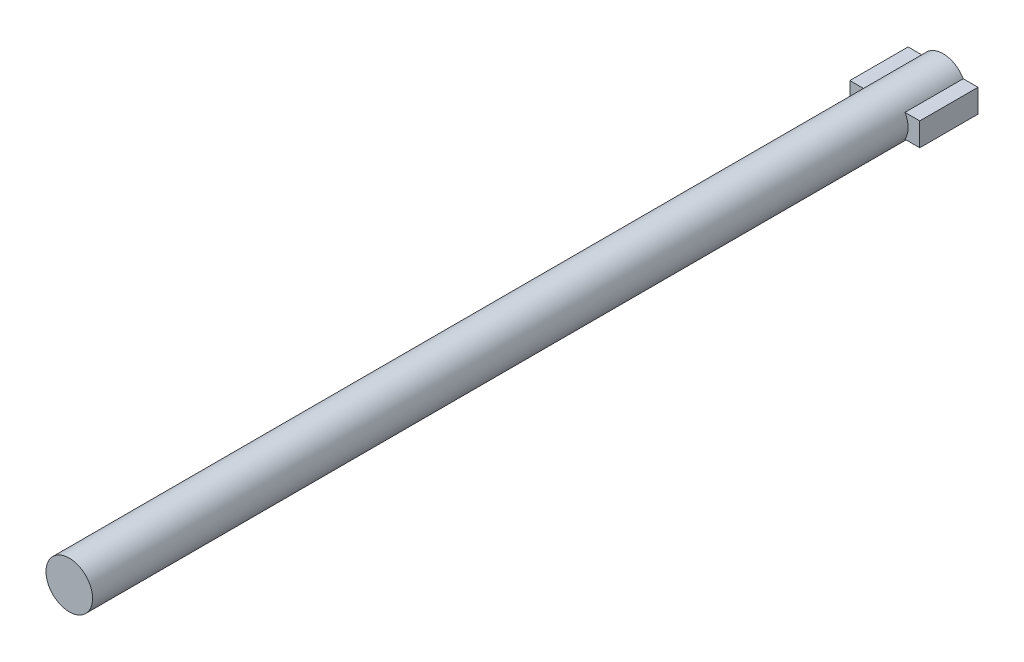
ISO-10303-21;
HEADER;
FILE_DESCRIPTION(('STEP AP214'),'2;1');
FILE_NAME('part.step','',(''),(''),'','','');
FILE_SCHEMA(('AUTOMOTIVE_DESIGN { 1 0 10303 214 1 1 1 1 }'));
ENDSEC;
DATA;
#1=APPLICATION_CONTEXT('core data for automotive mechanical design processes');
#2=APPLICATION_PROTOCOL_DEFINITION('international standard','automotive_design',2000,#1);
#3=PRODUCT_CONTEXT('',#1,'mechanical');
#4=PRODUCT('Part','Part','',(#3));
#5=PRODUCT_RELATED_PRODUCT_CATEGORY('part','',(#4));
#6=PRODUCT_DEFINITION_FORMATION('','',#4);
#7=PRODUCT_DEFINITION_CONTEXT('part definition',#1,'design');
#8=PRODUCT_DEFINITION('design','',#6,#7);
#9=PRODUCT_DEFINITION_SHAPE('','',#8);
#10=(LENGTH_UNIT() NAMED_UNIT(*) SI_UNIT(.MILLI.,.METRE.));
#11=(NAMED_UNIT(*) PLANE_ANGLE_UNIT() SI_UNIT($,.RADIAN.));
#12=(NAMED_UNIT(*) SI_UNIT($,.STERADIAN.) SOLID_ANGLE_UNIT());
#13=UNCERTAINTY_MEASURE_WITH_UNIT(LENGTH_MEASURE(1.E-05),#10,'distance_accuracy_value','');
#14=(GEOMETRIC_REPRESENTATION_CONTEXT(3) GLOBAL_UNCERTAINTY_ASSIGNED_CONTEXT((#13)) GLOBAL_UNIT_ASSIGNED_CONTEXT((#10,
#11,#12)) REPRESENTATION_CONTEXT('',''));
#15=CARTESIAN_POINT('',(0.,0.,0.));
#16=DIRECTION('',(0.,0.,1.));
#17=DIRECTION('',(1.,0.,0.));
#18=AXIS2_PLACEMENT_3D('',#15,#16,#17);
#19=CARTESIAN_POINT('',(0.,0.,150.));
#20=DIRECTION('',(0.,0.,-1.));
#21=DIRECTION('',(-1.,0.,0.));
#22=AXIS2_PLACEMENT_3D('',#19,#20,#21);
#23=CYLINDRICAL_SURFACE('',#22,4.);
#24=CARTESIAN_POINT('',(0.,0.,10.));
#25=DIRECTION('',(0.,0.,-1.));
#26=DIRECTION('',(-1.,0.,0.));
#27=AXIS2_PLACEMENT_3D('',#24,#25,#26);
#28=CIRCLE('',#27,4.);
#29=CARTESIAN_POINT('',(3.46410161513775,2.,10.));
#30=VERTEX_POINT('',#29);
#31=CARTESIAN_POINT('',(3.46410161513775,-2.,10.));
#32=VERTEX_POINT('',#31);
#33=EDGE_CURVE('E11',#30,#32,#28,.T.);
#34=ORIENTED_EDGE('',*,*,#33,.F.);
#35=DIRECTION('',(0.,0.,-1.));
#36=VECTOR('',#35,1.);
#37=CARTESIAN_POINT('',(3.46410161513775,2.,150.));
#38=LINE('',#37,#36);
#39=CARTESIAN_POINT('',(3.46410161513775,2.,0.));
#40=VERTEX_POINT('',#39);
#41=EDGE_CURVE('E150',#30,#40,#38,.T.);
#42=ORIENTED_EDGE('',*,*,#41,.T.);
#43=CARTESIAN_POINT('',(0.,0.,0.));
#44=DIRECTION('',(0.,0.,1.));
#45=DIRECTION('',(1.,0.,0.));
#46=AXIS2_PLACEMENT_3D('',#43,#44,#45);
#47=CIRCLE('',#46,4.);
#48=CARTESIAN_POINT('',(-3.46410161513775,2.,0.));
#49=VERTEX_POINT('',#48);
#50=EDGE_CURVE('E155',#40,#49,#47,.T.);
#51=ORIENTED_EDGE('',*,*,#50,.T.);
#52=DIRECTION('',(0.,0.,-1.));
#53=VECTOR('',#52,1.);
#54=CARTESIAN_POINT('',(-3.46410161513775,2.,150.));
#55=LINE('',#54,#53);
#56=CARTESIAN_POINT('',(-3.46410161513775,2.,10.));
#57=VERTEX_POINT('',#56);
#58=EDGE_CURVE('E148',#49,#57,#55,.F.);
#59=ORIENTED_EDGE('',*,*,#58,.T.);
#60=CARTESIAN_POINT('',(-3.46410161513775,-2.,10.));
#61=VERTEX_POINT('',#60);
#62=EDGE_CURVE('E38',#61,#57,#28,.T.);
#63=ORIENTED_EDGE('',*,*,#62,.F.);
#64=DIRECTION('',(0.,0.,-1.));
#65=VECTOR('',#64,1.);
#66=CARTESIAN_POINT('',(-3.46410161513775,-2.,150.));
#67=LINE('',#66,#65);
#68=CARTESIAN_POINT('',(-3.46410161513776,-2.,0.));
#69=VERTEX_POINT('',#68);
#70=EDGE_CURVE('E145',#61,#69,#67,.T.);
#71=ORIENTED_EDGE('',*,*,#70,.T.);
#72=CARTESIAN_POINT('',(3.46410161513775,-2.,0.));
#73=VERTEX_POINT('',#72);
#74=EDGE_CURVE('E152',#69,#73,#47,.T.);
#75=ORIENTED_EDGE('',*,*,#74,.T.);
#76=DIRECTION('',(0.,0.,-1.));
#77=VECTOR('',#76,1.);
#78=CARTESIAN_POINT('',(3.46410161513775,-2.,150.));
#79=LINE('',#78,#77);
#80=EDGE_CURVE('E49',#73,#32,#79,.F.);
#81=ORIENTED_EDGE('',*,*,#80,.T.);
#82=EDGE_LOOP('',(#34,#42,#51,#59,#63,#71,#75,#81));
#83=FACE_BOUND('',#82,.T.);
#84=CARTESIAN_POINT('',(0.,0.,150.));
#85=DIRECTION('',(0.,0.,1.));
#86=DIRECTION('',(1.,0.,0.));
#87=AXIS2_PLACEMENT_3D('',#84,#85,#86);
#88=CIRCLE('',#87,4.);
#89=CARTESIAN_POINT('',(4.,0.,150.));
#90=VERTEX_POINT('',#89);
#91=EDGE_CURVE('E153',#90,#90,#88,.T.);
#92=ORIENTED_EDGE('',*,*,#91,.F.);
#93=EDGE_LOOP('',(#92));
#94=FACE_BOUND('',#93,.T.);
#95=ADVANCED_FACE('F35',(#83,#94),#23,.T.);
#96=CARTESIAN_POINT('',(0.,0.,150.));
#97=DIRECTION('',(0.,0.,1.));
#98=DIRECTION('',(1.,0.,0.));
#99=AXIS2_PLACEMENT_3D('',#96,#97,#98);
#100=PLANE('',#99);
#101=ORIENTED_EDGE('',*,*,#91,.T.);
#102=EDGE_LOOP('',(#101));
#103=FACE_BOUND('',#102,.T.);
#104=ADVANCED_FACE('F180',(#103),#100,.T.);
#105=CARTESIAN_POINT('',(0.,0.,0.));
#106=DIRECTION('',(0.,0.,1.));
#107=DIRECTION('',(1.,0.,0.));
#108=AXIS2_PLACEMENT_3D('',#105,#106,#107);
#109=PLANE('',#108);
#110=ORIENTED_EDGE('',*,*,#74,.F.);
#111=DIRECTION('',(-1.,0.,0.));
#112=VECTOR('',#111,1.);
#113=CARTESIAN_POINT('',(6.,-2.,0.));
#114=LINE('',#113,#112);
#115=CARTESIAN_POINT('',(-6.,-2.,0.));
#116=VERTEX_POINT('',#115);
#117=EDGE_CURVE('E134',#69,#116,#114,.T.);
#118=ORIENTED_EDGE('',*,*,#117,.T.);
#119=DIRECTION('',(0.,1.,0.));
#120=VECTOR('',#119,1.);
#121=CARTESIAN_POINT('',(-6.,2.,0.));
#122=LINE('',#121,#120);
#123=CARTESIAN_POINT('',(-6.,2.,0.));
#124=VERTEX_POINT('',#123);
#125=EDGE_CURVE('E136',#116,#124,#122,.T.);
#126=ORIENTED_EDGE('',*,*,#125,.T.);
#127=DIRECTION('',(1.,0.,0.));
#128=VECTOR('',#127,1.);
#129=CARTESIAN_POINT('',(6.,2.,0.));
#130=LINE('',#129,#128);
#131=EDGE_CURVE('E121',#124,#49,#130,.T.);
#132=ORIENTED_EDGE('',*,*,#131,.T.);
#133=ORIENTED_EDGE('',*,*,#50,.F.);
#134=CARTESIAN_POINT('',(6.,2.,0.));
#135=VERTEX_POINT('',#134);
#136=EDGE_CURVE('E124',#40,#135,#130,.T.);
#137=ORIENTED_EDGE('',*,*,#136,.T.);
#138=DIRECTION('',(0.,-1.,0.));
#139=VECTOR('',#138,1.);
#140=CARTESIAN_POINT('',(6.,2.,0.));
#141=LINE('',#140,#139);
#142=CARTESIAN_POINT('',(6.,-2.,0.));
#143=VERTEX_POINT('',#142);
#144=EDGE_CURVE('E132',#135,#143,#141,.T.);
#145=ORIENTED_EDGE('',*,*,#144,.T.);
#146=EDGE_CURVE('E101',#143,#73,#114,.T.);
#147=ORIENTED_EDGE('',*,*,#146,.T.);
#148=EDGE_LOOP('',(#110,#118,#126,#132,#133,#137,#145,#147));
#149=FACE_BOUND('',#148,.T.);
#150=ADVANCED_FACE('F161',(#149),#109,.F.);
#151=CARTESIAN_POINT('',(-6.,2.,10.));
#152=DIRECTION('',(-1.,0.,0.));
#153=DIRECTION('',(0.,-1.,0.));
#154=AXIS2_PLACEMENT_3D('',#151,#152,#153);
#155=PLANE('',#154);
#156=ORIENTED_EDGE('',*,*,#125,.F.);
#157=DIRECTION('',(0.,0.,-1.));
#158=VECTOR('',#157,1.);
#159=CARTESIAN_POINT('',(-6.,-2.,10.));
#160=LINE('',#159,#158);
#161=CARTESIAN_POINT('',(-6.,-2.,10.));
#162=VERTEX_POINT('',#161);
#163=EDGE_CURVE('E106',#162,#116,#160,.T.);
#164=ORIENTED_EDGE('',*,*,#163,.F.);
#165=DIRECTION('',(0.,1.,0.));
#166=VECTOR('',#165,1.);
#167=CARTESIAN_POINT('',(-6.,2.,10.));
#168=LINE('',#167,#166);
#169=CARTESIAN_POINT('',(-6.,2.,10.));
#170=VERTEX_POINT('',#169);
#171=EDGE_CURVE('E114',#162,#170,#168,.T.);
#172=ORIENTED_EDGE('',*,*,#171,.T.);
#173=DIRECTION('',(0.,0.,-1.));
#174=VECTOR('',#173,1.);
#175=CARTESIAN_POINT('',(-6.,2.,10.));
#176=LINE('',#175,#174);
#177=EDGE_CURVE('E140',#170,#124,#176,.T.);
#178=ORIENTED_EDGE('',*,*,#177,.T.);
#179=EDGE_LOOP('',(#156,#164,#172,#178));
#180=FACE_BOUND('',#179,.T.);
#181=ADVANCED_FACE('F190',(#180),#155,.T.);
#182=CARTESIAN_POINT('',(0.,0.,10.));
#183=DIRECTION('',(0.,0.,-1.));
#184=DIRECTION('',(-1.,0.,0.));
#185=AXIS2_PLACEMENT_3D('',#182,#183,#184);
#186=PLANE('',#185);
#187=DIRECTION('',(-1.,0.,0.));
#188=VECTOR('',#187,1.);
#189=CARTESIAN_POINT('',(6.,-2.,10.));
#190=LINE('',#189,#188);
#191=EDGE_CURVE('E115',#61,#162,#190,.T.);
#192=ORIENTED_EDGE('',*,*,#191,.F.);
#193=ORIENTED_EDGE('',*,*,#62,.T.);
#194=DIRECTION('',(1.,0.,0.));
#195=VECTOR('',#194,1.);
#196=CARTESIAN_POINT('',(6.,2.,10.));
#197=LINE('',#196,#195);
#198=EDGE_CURVE('E107',#170,#57,#197,.T.);
#199=ORIENTED_EDGE('',*,*,#198,.F.);
#200=ORIENTED_EDGE('',*,*,#171,.F.);
#201=EDGE_LOOP('',(#192,#193,#199,#200));
#202=FACE_BOUND('',#201,.T.);
#203=ADVANCED_FACE('F175',(#202),#186,.F.);
#204=CARTESIAN_POINT('',(6.,-2.,10.));
#205=DIRECTION('',(0.,-1.,0.));
#206=DIRECTION('',(1.,0.,0.));
#207=AXIS2_PLACEMENT_3D('',#204,#205,#206);
#208=PLANE('',#207);
#209=ORIENTED_EDGE('',*,*,#70,.F.);
#210=ORIENTED_EDGE('',*,*,#191,.T.);
#211=ORIENTED_EDGE('',*,*,#163,.T.);
#212=ORIENTED_EDGE('',*,*,#117,.F.);
#213=EDGE_LOOP('',(#209,#210,#211,#212));
#214=FACE_BOUND('',#213,.T.);
#215=ADVANCED_FACE('F173',(#214),#208,.T.);
#216=CARTESIAN_POINT('',(6.,2.,10.));
#217=DIRECTION('',(0.,1.,0.));
#218=DIRECTION('',(0.,0.,1.));
#219=AXIS2_PLACEMENT_3D('',#216,#217,#218);
#220=PLANE('',#219);
#221=ORIENTED_EDGE('',*,*,#58,.F.);
#222=ORIENTED_EDGE('',*,*,#131,.F.);
#223=ORIENTED_EDGE('',*,*,#177,.F.);
#224=ORIENTED_EDGE('',*,*,#198,.T.);
#225=EDGE_LOOP('',(#221,#222,#223,#224));
#226=FACE_BOUND('',#225,.T.);
#227=ADVANCED_FACE('F167',(#226),#220,.T.);
#228=CARTESIAN_POINT('',(6.,2.,10.));
#229=VERTEX_POINT('',#228);
#230=EDGE_CURVE('E129',#30,#229,#197,.T.);
#231=ORIENTED_EDGE('',*,*,#230,.F.);
#232=ORIENTED_EDGE('',*,*,#33,.T.);
#233=CARTESIAN_POINT('',(6.,-2.,10.));
#234=VERTEX_POINT('',#233);
#235=EDGE_CURVE('E99',#234,#32,#190,.T.);
#236=ORIENTED_EDGE('',*,*,#235,.F.);
#237=DIRECTION('',(0.,-1.,0.));
#238=VECTOR('',#237,1.);
#239=CARTESIAN_POINT('',(6.,2.,10.));
#240=LINE('',#239,#238);
#241=EDGE_CURVE('E113',#229,#234,#240,.T.);
#242=ORIENTED_EDGE('',*,*,#241,.F.);
#243=EDGE_LOOP('',(#231,#232,#236,#242));
#244=FACE_BOUND('',#243,.T.);
#245=ADVANCED_FACE('F112',(#244),#186,.F.);
#246=ORIENTED_EDGE('',*,*,#41,.F.);
#247=ORIENTED_EDGE('',*,*,#230,.T.);
#248=DIRECTION('',(0.,0.,-1.));
#249=VECTOR('',#248,1.);
#250=CARTESIAN_POINT('',(6.,2.,10.));
#251=LINE('',#250,#249);
#252=EDGE_CURVE('E120',#229,#135,#251,.T.);
#253=ORIENTED_EDGE('',*,*,#252,.T.);
#254=ORIENTED_EDGE('',*,*,#136,.F.);
#255=EDGE_LOOP('',(#246,#247,#253,#254));
#256=FACE_BOUND('',#255,.T.);
#257=ADVANCED_FACE('F164',(#256),#220,.T.);
#258=ORIENTED_EDGE('',*,*,#80,.F.);
#259=ORIENTED_EDGE('',*,*,#146,.F.);
#260=DIRECTION('',(0.,0.,-1.));
#261=VECTOR('',#260,1.);
#262=CARTESIAN_POINT('',(6.,-2.,10.));
#263=LINE('',#262,#261);
#264=EDGE_CURVE('E96',#234,#143,#263,.T.);
#265=ORIENTED_EDGE('',*,*,#264,.F.);
#266=ORIENTED_EDGE('',*,*,#235,.T.);
#267=EDGE_LOOP('',(#258,#259,#265,#266));
#268=FACE_BOUND('',#267,.T.);
#269=ADVANCED_FACE('F98',(#268),#208,.T.);
#270=CARTESIAN_POINT('',(6.,2.,10.));
#271=DIRECTION('',(1.,0.,0.));
#272=DIRECTION('',(0.,1.,0.));
#273=AXIS2_PLACEMENT_3D('',#270,#271,#272);
#274=PLANE('',#273);
#275=ORIENTED_EDGE('',*,*,#144,.F.);
#276=ORIENTED_EDGE('',*,*,#252,.F.);
#277=ORIENTED_EDGE('',*,*,#241,.T.);
#278=ORIENTED_EDGE('',*,*,#264,.T.);
#279=EDGE_LOOP('',(#275,#276,#277,#278));
#280=FACE_BOUND('',#279,.T.);
#281=ADVANCED_FACE('F118',(#280),#274,.T.);
#282=CLOSED_SHELL('',(#95,#104,#150,#181,#203,#215,#227,#245,#257,#269,#281));
#283=MANIFOLD_SOLID_BREP('B2',#282);
#284=ADVANCED_BREP_SHAPE_REPRESENTATION('',(#18,#283),#14);
#285=SHAPE_DEFINITION_REPRESENTATION(#9,#284);
ENDSEC;
END-ISO-10303-21;
